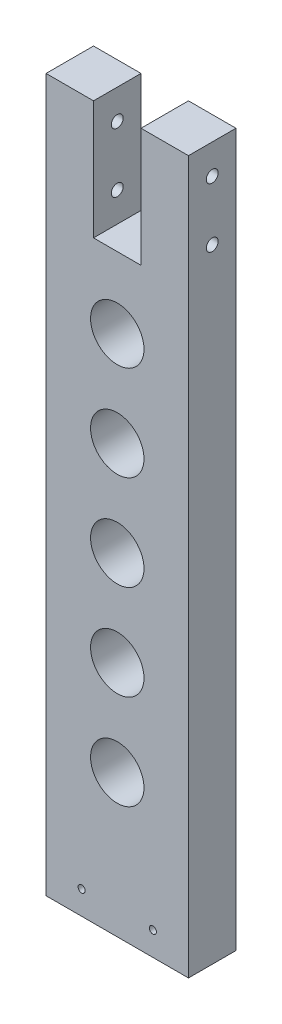
ISO-10303-21;
HEADER;
FILE_DESCRIPTION(('STEP AP214'),'2;1');
FILE_NAME('part.step','',(''),(''),'','','');
FILE_SCHEMA(('AUTOMOTIVE_DESIGN { 1 0 10303 214 1 1 1 1 }'));
ENDSEC;
DATA;
#1=APPLICATION_CONTEXT('core data for automotive mechanical design processes');
#2=APPLICATION_PROTOCOL_DEFINITION('international standard','automotive_design',2000,#1);
#3=PRODUCT_CONTEXT('',#1,'mechanical');
#4=PRODUCT('Part','Part','',(#3));
#5=PRODUCT_RELATED_PRODUCT_CATEGORY('part','',(#4));
#6=PRODUCT_DEFINITION_FORMATION('','',#4);
#7=PRODUCT_DEFINITION_CONTEXT('part definition',#1,'design');
#8=PRODUCT_DEFINITION('design','',#6,#7);
#9=PRODUCT_DEFINITION_SHAPE('','',#8);
#10=(LENGTH_UNIT() NAMED_UNIT(*) SI_UNIT(.MILLI.,.METRE.));
#11=(NAMED_UNIT(*) PLANE_ANGLE_UNIT() SI_UNIT($,.RADIAN.));
#12=(NAMED_UNIT(*) SI_UNIT($,.STERADIAN.) SOLID_ANGLE_UNIT());
#13=UNCERTAINTY_MEASURE_WITH_UNIT(LENGTH_MEASURE(1.E-05),#10,'distance_accuracy_value','');
#14=(GEOMETRIC_REPRESENTATION_CONTEXT(3) GLOBAL_UNCERTAINTY_ASSIGNED_CONTEXT((#13)) GLOBAL_UNIT_ASSIGNED_CONTEXT((#10,
#11,#12)) REPRESENTATION_CONTEXT('',''));
#15=CARTESIAN_POINT('',(0.,0.,0.));
#16=DIRECTION('',(0.,0.,1.));
#17=DIRECTION('',(1.,0.,0.));
#18=AXIS2_PLACEMENT_3D('',#15,#16,#17);
#19=CARTESIAN_POINT('',(0.,300.,0.));
#20=DIRECTION('',(0.,1.,0.));
#21=DIRECTION('',(0.,0.,1.));
#22=AXIS2_PLACEMENT_3D('',#19,#20,#21);
#23=PLANE('',#22);
#24=DIRECTION('',(0.,0.,1.));
#25=VECTOR('',#24,1.);
#26=CARTESIAN_POINT('',(-10.,300.,-10.));
#27=LINE('',#26,#25);
#28=CARTESIAN_POINT('',(-10.,300.,-10.));
#29=VERTEX_POINT('',#28);
#30=CARTESIAN_POINT('',(-10.,300.,10.));
#31=VERTEX_POINT('',#30);
#32=EDGE_CURVE('E141',#29,#31,#27,.T.);
#33=ORIENTED_EDGE('',*,*,#32,.F.);
#34=DIRECTION('',(-1.,0.,0.));
#35=VECTOR('',#34,1.);
#36=CARTESIAN_POINT('',(-30.,300.,-10.));
#37=LINE('',#36,#35);
#38=CARTESIAN_POINT('',(-30.,300.,-10.));
#39=VERTEX_POINT('',#38);
#40=EDGE_CURVE('E130',#29,#39,#37,.T.);
#41=ORIENTED_EDGE('',*,*,#40,.T.);
#42=DIRECTION('',(0.,0.,1.));
#43=VECTOR('',#42,1.);
#44=CARTESIAN_POINT('',(-30.,300.,-10.));
#45=LINE('',#44,#43);
#46=CARTESIAN_POINT('',(-30.,300.,10.));
#47=VERTEX_POINT('',#46);
#48=EDGE_CURVE('E150',#39,#47,#45,.T.);
#49=ORIENTED_EDGE('',*,*,#48,.T.);
#50=DIRECTION('',(1.,0.,0.));
#51=VECTOR('',#50,1.);
#52=CARTESIAN_POINT('',(-30.,300.,10.));
#53=LINE('',#52,#51);
#54=EDGE_CURVE('E152',#47,#31,#53,.T.);
#55=ORIENTED_EDGE('',*,*,#54,.T.);
#56=EDGE_LOOP('',(#33,#41,#49,#55));
#57=FACE_BOUND('',#56,.T.);
#58=ADVANCED_FACE('F32',(#57),#23,.T.);
#59=CARTESIAN_POINT('',(30.,300.,-10.));
#60=DIRECTION('',(-1.,0.,0.));
#61=DIRECTION('',(0.,0.,1.));
#62=AXIS2_PLACEMENT_3D('',#59,#60,#61);
#63=PLANE('',#62);
#64=CARTESIAN_POINT('',(30.,287.5,0.));
#65=DIRECTION('',(1.,0.,0.));
#66=DIRECTION('',(0.,0.,-1.));
#67=AXIS2_PLACEMENT_3D('',#64,#65,#66);
#68=CIRCLE('',#67,2.5);
#69=CARTESIAN_POINT('',(30.,287.5,-2.5));
#70=VERTEX_POINT('',#69);
#71=EDGE_CURVE('E283',#70,#70,#68,.T.);
#72=ORIENTED_EDGE('',*,*,#71,.F.);
#73=EDGE_LOOP('',(#72));
#74=FACE_BOUND('',#73,.T.);
#75=CARTESIAN_POINT('',(30.,262.5,0.));
#76=DIRECTION('',(1.,0.,0.));
#77=DIRECTION('',(0.,0.,-1.));
#78=AXIS2_PLACEMENT_3D('',#75,#76,#77);
#79=CIRCLE('',#78,2.5);
#80=CARTESIAN_POINT('',(30.,262.5,-2.5));
#81=VERTEX_POINT('',#80);
#82=EDGE_CURVE('E177',#81,#81,#79,.T.);
#83=ORIENTED_EDGE('',*,*,#82,.F.);
#84=EDGE_LOOP('',(#83));
#85=FACE_BOUND('',#84,.T.);
#86=DIRECTION('',(0.,0.,-1.));
#87=VECTOR('',#86,1.);
#88=CARTESIAN_POINT('',(30.,0.,-10.));
#89=LINE('',#88,#87);
#90=CARTESIAN_POINT('',(30.,0.,10.));
#91=VERTEX_POINT('',#90);
#92=CARTESIAN_POINT('',(30.,0.,-10.));
#93=VERTEX_POINT('',#92);
#94=EDGE_CURVE('E143',#91,#93,#89,.T.);
#95=ORIENTED_EDGE('',*,*,#94,.T.);
#96=DIRECTION('',(0.,-1.,0.));
#97=VECTOR('',#96,1.);
#98=CARTESIAN_POINT('',(30.,300.,-10.));
#99=LINE('',#98,#97);
#100=CARTESIAN_POINT('',(30.,300.,-10.));
#101=VERTEX_POINT('',#100);
#102=EDGE_CURVE('E11',#101,#93,#99,.T.);
#103=ORIENTED_EDGE('',*,*,#102,.F.);
#104=DIRECTION('',(0.,0.,-1.));
#105=VECTOR('',#104,1.);
#106=CARTESIAN_POINT('',(30.,300.,-10.));
#107=LINE('',#106,#105);
#108=CARTESIAN_POINT('',(30.,300.,10.));
#109=VERTEX_POINT('',#108);
#110=EDGE_CURVE('E147',#109,#101,#107,.T.);
#111=ORIENTED_EDGE('',*,*,#110,.F.);
#112=DIRECTION('',(0.,-1.,0.));
#113=VECTOR('',#112,1.);
#114=CARTESIAN_POINT('',(30.,300.,10.));
#115=LINE('',#114,#113);
#116=EDGE_CURVE('E155',#109,#91,#115,.T.);
#117=ORIENTED_EDGE('',*,*,#116,.T.);
#118=EDGE_LOOP('',(#95,#103,#111,#117));
#119=FACE_BOUND('',#118,.T.);
#120=ADVANCED_FACE('F34',(#74,#85,#119),#63,.F.);
#121=CARTESIAN_POINT('',(-30.,300.,-10.));
#122=DIRECTION('',(0.,0.,1.));
#123=DIRECTION('',(1.,0.,0.));
#124=AXIS2_PLACEMENT_3D('',#121,#122,#123);
#125=PLANE('',#124);
#126=CARTESIAN_POINT('',(15.,10.,-10.));
#127=DIRECTION('',(0.,0.,1.));
#128=DIRECTION('',(1.,0.,0.));
#129=AXIS2_PLACEMENT_3D('',#126,#127,#128);
#130=CIRCLE('',#129,1.5);
#131=CARTESIAN_POINT('',(16.5,10.,-10.));
#132=VERTEX_POINT('',#131);
#133=EDGE_CURVE('E186',#132,#132,#130,.T.);
#134=ORIENTED_EDGE('',*,*,#133,.T.);
#135=EDGE_LOOP('',(#134));
#136=FACE_BOUND('',#135,.T.);
#137=CARTESIAN_POINT('',(-15.,10.,-10.));
#138=DIRECTION('',(0.,0.,1.));
#139=DIRECTION('',(1.,0.,0.));
#140=AXIS2_PLACEMENT_3D('',#137,#138,#139);
#141=CIRCLE('',#140,1.5);
#142=CARTESIAN_POINT('',(-13.5,10.,-10.));
#143=VERTEX_POINT('',#142);
#144=EDGE_CURVE('E192',#143,#143,#141,.T.);
#145=ORIENTED_EDGE('',*,*,#144,.T.);
#146=EDGE_LOOP('',(#145));
#147=FACE_BOUND('',#146,.T.);
#148=CARTESIAN_POINT('',(0.,180.,-10.));
#149=DIRECTION('',(0.,0.,1.));
#150=DIRECTION('',(1.,0.,0.));
#151=AXIS2_PLACEMENT_3D('',#148,#149,#150);
#152=CIRCLE('',#151,11.25);
#153=CARTESIAN_POINT('',(11.25,180.,-10.));
#154=VERTEX_POINT('',#153);
#155=EDGE_CURVE('E218',#154,#154,#152,.T.);
#156=ORIENTED_EDGE('',*,*,#155,.T.);
#157=EDGE_LOOP('',(#156));
#158=FACE_BOUND('',#157,.T.);
#159=CARTESIAN_POINT('',(0.,140.,-10.));
#160=DIRECTION('',(0.,0.,1.));
#161=DIRECTION('',(1.,0.,0.));
#162=AXIS2_PLACEMENT_3D('',#159,#160,#161);
#163=CIRCLE('',#162,11.25);
#164=CARTESIAN_POINT('',(11.25,140.,-10.));
#165=VERTEX_POINT('',#164);
#166=EDGE_CURVE('E215',#165,#165,#163,.T.);
#167=ORIENTED_EDGE('',*,*,#166,.T.);
#168=EDGE_LOOP('',(#167));
#169=FACE_BOUND('',#168,.T.);
#170=CARTESIAN_POINT('',(0.,100.,-10.));
#171=DIRECTION('',(0.,0.,1.));
#172=DIRECTION('',(1.,0.,0.));
#173=AXIS2_PLACEMENT_3D('',#170,#171,#172);
#174=CIRCLE('',#173,11.25);
#175=CARTESIAN_POINT('',(11.25,100.,-10.));
#176=VERTEX_POINT('',#175);
#177=EDGE_CURVE('E212',#176,#176,#174,.T.);
#178=ORIENTED_EDGE('',*,*,#177,.T.);
#179=EDGE_LOOP('',(#178));
#180=FACE_BOUND('',#179,.T.);
#181=CARTESIAN_POINT('',(0.,60.,-10.));
#182=DIRECTION('',(0.,0.,1.));
#183=DIRECTION('',(1.,0.,0.));
#184=AXIS2_PLACEMENT_3D('',#181,#182,#183);
#185=CIRCLE('',#184,11.25);
#186=CARTESIAN_POINT('',(11.25,60.,-10.));
#187=VERTEX_POINT('',#186);
#188=EDGE_CURVE('E201',#187,#187,#185,.T.);
#189=ORIENTED_EDGE('',*,*,#188,.T.);
#190=EDGE_LOOP('',(#189));
#191=FACE_BOUND('',#190,.T.);
#192=CARTESIAN_POINT('',(0.,220.,-10.));
#193=DIRECTION('',(0.,0.,1.));
#194=DIRECTION('',(1.,0.,0.));
#195=AXIS2_PLACEMENT_3D('',#192,#193,#194);
#196=CIRCLE('',#195,11.25);
#197=CARTESIAN_POINT('',(11.25,220.,-10.));
#198=VERTEX_POINT('',#197);
#199=EDGE_CURVE('E135',#198,#198,#196,.T.);
#200=ORIENTED_EDGE('',*,*,#199,.T.);
#201=EDGE_LOOP('',(#200));
#202=FACE_BOUND('',#201,.T.);
#203=ORIENTED_EDGE('',*,*,#40,.F.);
#204=DIRECTION('',(0.,-1.,0.));
#205=VECTOR('',#204,1.);
#206=CARTESIAN_POINT('',(-10.,300.,-10.));
#207=LINE('',#206,#205);
#208=CARTESIAN_POINT('',(-10.,250.,-10.));
#209=VERTEX_POINT('',#208);
#210=EDGE_CURVE('E112',#29,#209,#207,.T.);
#211=ORIENTED_EDGE('',*,*,#210,.T.);
#212=DIRECTION('',(1.,0.,0.));
#213=VECTOR('',#212,1.);
#214=CARTESIAN_POINT('',(-10.,250.,-10.));
#215=LINE('',#214,#213);
#216=CARTESIAN_POINT('',(9.99999999999997,250.,-10.));
#217=VERTEX_POINT('',#216);
#218=EDGE_CURVE('E123',#209,#217,#215,.T.);
#219=ORIENTED_EDGE('',*,*,#218,.T.);
#220=DIRECTION('',(0.,1.,0.));
#221=VECTOR('',#220,1.);
#222=CARTESIAN_POINT('',(10.,300.,-10.));
#223=LINE('',#222,#221);
#224=CARTESIAN_POINT('',(10.,300.,-10.));
#225=VERTEX_POINT('',#224);
#226=EDGE_CURVE('E120',#217,#225,#223,.T.);
#227=ORIENTED_EDGE('',*,*,#226,.T.);
#228=EDGE_CURVE('E86',#101,#225,#37,.T.);
#229=ORIENTED_EDGE('',*,*,#228,.F.);
#230=ORIENTED_EDGE('',*,*,#102,.T.);
#231=DIRECTION('',(-1.,0.,0.));
#232=VECTOR('',#231,1.);
#233=CARTESIAN_POINT('',(-30.,0.,-10.));
#234=LINE('',#233,#232);
#235=CARTESIAN_POINT('',(-30.,0.,-10.));
#236=VERTEX_POINT('',#235);
#237=EDGE_CURVE('E158',#93,#236,#234,.T.);
#238=ORIENTED_EDGE('',*,*,#237,.T.);
#239=DIRECTION('',(0.,-1.,0.));
#240=VECTOR('',#239,1.);
#241=CARTESIAN_POINT('',(-30.,300.,-10.));
#242=LINE('',#241,#240);
#243=EDGE_CURVE('E41',#39,#236,#242,.T.);
#244=ORIENTED_EDGE('',*,*,#243,.F.);
#245=EDGE_LOOP('',(#203,#211,#219,#227,#229,#230,#238,#244));
#246=FACE_BOUND('',#245,.T.);
#247=ADVANCED_FACE('F128',(#136,#147,#158,#169,#180,#191,#202,#246),#125,.F.);
#248=CARTESIAN_POINT('',(-30.,300.,-10.));
#249=DIRECTION('',(1.,0.,0.));
#250=DIRECTION('',(0.,0.,-1.));
#251=AXIS2_PLACEMENT_3D('',#248,#249,#250);
#252=PLANE('',#251);
#253=CARTESIAN_POINT('',(-30.,287.5,0.));
#254=DIRECTION('',(1.,0.,0.));
#255=DIRECTION('',(0.,0.,-1.));
#256=AXIS2_PLACEMENT_3D('',#253,#254,#255);
#257=CIRCLE('',#256,2.5);
#258=CARTESIAN_POINT('',(-30.,287.5,-2.5));
#259=VERTEX_POINT('',#258);
#260=EDGE_CURVE('E281',#259,#259,#257,.T.);
#261=ORIENTED_EDGE('',*,*,#260,.T.);
#262=EDGE_LOOP('',(#261));
#263=FACE_BOUND('',#262,.T.);
#264=CARTESIAN_POINT('',(-30.,262.5,0.));
#265=DIRECTION('',(1.,0.,0.));
#266=DIRECTION('',(0.,0.,-1.));
#267=AXIS2_PLACEMENT_3D('',#264,#265,#266);
#268=CIRCLE('',#267,2.5);
#269=CARTESIAN_POINT('',(-30.,262.5,-2.5));
#270=VERTEX_POINT('',#269);
#271=EDGE_CURVE('E170',#270,#270,#268,.T.);
#272=ORIENTED_EDGE('',*,*,#271,.T.);
#273=EDGE_LOOP('',(#272));
#274=FACE_BOUND('',#273,.T.);
#275=DIRECTION('',(0.,0.,1.));
#276=VECTOR('',#275,1.);
#277=CARTESIAN_POINT('',(-30.,0.,-10.));
#278=LINE('',#277,#276);
#279=CARTESIAN_POINT('',(-30.,0.,10.));
#280=VERTEX_POINT('',#279);
#281=EDGE_CURVE('E160',#236,#280,#278,.T.);
#282=ORIENTED_EDGE('',*,*,#281,.T.);
#283=DIRECTION('',(0.,-1.,0.));
#284=VECTOR('',#283,1.);
#285=CARTESIAN_POINT('',(-30.,300.,10.));
#286=LINE('',#285,#284);
#287=EDGE_CURVE('E164',#47,#280,#286,.T.);
#288=ORIENTED_EDGE('',*,*,#287,.F.);
#289=ORIENTED_EDGE('',*,*,#48,.F.);
#290=ORIENTED_EDGE('',*,*,#243,.T.);
#291=EDGE_LOOP('',(#282,#288,#289,#290));
#292=FACE_BOUND('',#291,.T.);
#293=ADVANCED_FACE('F260',(#263,#274,#292),#252,.F.);
#294=CARTESIAN_POINT('',(-30.,300.,10.));
#295=DIRECTION('',(0.,0.,-1.));
#296=DIRECTION('',(-1.,0.,0.));
#297=AXIS2_PLACEMENT_3D('',#294,#295,#296);
#298=PLANE('',#297);
#299=CARTESIAN_POINT('',(15.,10.,10.));
#300=DIRECTION('',(0.,0.,1.));
#301=DIRECTION('',(1.,0.,0.));
#302=AXIS2_PLACEMENT_3D('',#299,#300,#301);
#303=CIRCLE('',#302,1.5);
#304=CARTESIAN_POINT('',(16.5,10.,10.));
#305=VERTEX_POINT('',#304);
#306=EDGE_CURVE('E174',#305,#305,#303,.T.);
#307=ORIENTED_EDGE('',*,*,#306,.F.);
#308=EDGE_LOOP('',(#307));
#309=FACE_BOUND('',#308,.T.);
#310=CARTESIAN_POINT('',(-15.,10.,10.));
#311=DIRECTION('',(0.,0.,1.));
#312=DIRECTION('',(1.,0.,0.));
#313=AXIS2_PLACEMENT_3D('',#310,#311,#312);
#314=CIRCLE('',#313,1.5);
#315=CARTESIAN_POINT('',(-13.5,10.,10.));
#316=VERTEX_POINT('',#315);
#317=EDGE_CURVE('E189',#316,#316,#314,.T.);
#318=ORIENTED_EDGE('',*,*,#317,.F.);
#319=EDGE_LOOP('',(#318));
#320=FACE_BOUND('',#319,.T.);
#321=CARTESIAN_POINT('',(0.,180.,10.));
#322=DIRECTION('',(0.,0.,1.));
#323=DIRECTION('',(1.,0.,0.));
#324=AXIS2_PLACEMENT_3D('',#321,#322,#323);
#325=CIRCLE('',#324,11.25);
#326=CARTESIAN_POINT('',(11.25,180.,10.));
#327=VERTEX_POINT('',#326);
#328=EDGE_CURVE('E198',#327,#327,#325,.T.);
#329=ORIENTED_EDGE('',*,*,#328,.F.);
#330=EDGE_LOOP('',(#329));
#331=FACE_BOUND('',#330,.T.);
#332=CARTESIAN_POINT('',(0.,140.,10.));
#333=DIRECTION('',(0.,0.,1.));
#334=DIRECTION('',(1.,0.,0.));
#335=AXIS2_PLACEMENT_3D('',#332,#333,#334);
#336=CIRCLE('',#335,11.25);
#337=CARTESIAN_POINT('',(11.25,140.,10.));
#338=VERTEX_POINT('',#337);
#339=EDGE_CURVE('E202',#338,#338,#336,.T.);
#340=ORIENTED_EDGE('',*,*,#339,.F.);
#341=EDGE_LOOP('',(#340));
#342=FACE_BOUND('',#341,.T.);
#343=CARTESIAN_POINT('',(0.,100.,10.));
#344=DIRECTION('',(0.,0.,1.));
#345=DIRECTION('',(1.,0.,0.));
#346=AXIS2_PLACEMENT_3D('',#343,#344,#345);
#347=CIRCLE('',#346,11.25);
#348=CARTESIAN_POINT('',(11.25,100.,10.));
#349=VERTEX_POINT('',#348);
#350=EDGE_CURVE('E205',#349,#349,#347,.T.);
#351=ORIENTED_EDGE('',*,*,#350,.F.);
#352=EDGE_LOOP('',(#351));
#353=FACE_BOUND('',#352,.T.);
#354=CARTESIAN_POINT('',(0.,60.,10.));
#355=DIRECTION('',(0.,0.,1.));
#356=DIRECTION('',(1.,0.,0.));
#357=AXIS2_PLACEMENT_3D('',#354,#355,#356);
#358=CIRCLE('',#357,11.25);
#359=CARTESIAN_POINT('',(11.25,60.,10.));
#360=VERTEX_POINT('',#359);
#361=EDGE_CURVE('E195',#360,#360,#358,.T.);
#362=ORIENTED_EDGE('',*,*,#361,.F.);
#363=EDGE_LOOP('',(#362));
#364=FACE_BOUND('',#363,.T.);
#365=CARTESIAN_POINT('',(0.,220.,10.));
#366=DIRECTION('',(0.,0.,1.));
#367=DIRECTION('',(1.,0.,0.));
#368=AXIS2_PLACEMENT_3D('',#365,#366,#367);
#369=CIRCLE('',#368,11.25);
#370=CARTESIAN_POINT('',(11.25,220.,10.));
#371=VERTEX_POINT('',#370);
#372=EDGE_CURVE('E220',#371,#371,#369,.T.);
#373=ORIENTED_EDGE('',*,*,#372,.F.);
#374=EDGE_LOOP('',(#373));
#375=FACE_BOUND('',#374,.T.);
#376=DIRECTION('',(1.,0.,0.));
#377=VECTOR('',#376,1.);
#378=CARTESIAN_POINT('',(-10.,250.,10.));
#379=LINE('',#378,#377);
#380=CARTESIAN_POINT('',(-10.,250.,10.));
#381=VERTEX_POINT('',#380);
#382=CARTESIAN_POINT('',(9.99999999999997,250.,10.));
#383=VERTEX_POINT('',#382);
#384=EDGE_CURVE('E132',#381,#383,#379,.T.);
#385=ORIENTED_EDGE('',*,*,#384,.F.);
#386=DIRECTION('',(0.,-1.,0.));
#387=VECTOR('',#386,1.);
#388=CARTESIAN_POINT('',(-10.,300.,10.));
#389=LINE('',#388,#387);
#390=EDGE_CURVE('E115',#31,#381,#389,.T.);
#391=ORIENTED_EDGE('',*,*,#390,.F.);
#392=ORIENTED_EDGE('',*,*,#54,.F.);
#393=ORIENTED_EDGE('',*,*,#287,.T.);
#394=DIRECTION('',(1.,0.,0.));
#395=VECTOR('',#394,1.);
#396=CARTESIAN_POINT('',(-30.,0.,10.));
#397=LINE('',#396,#395);
#398=EDGE_CURVE('E79',#280,#91,#397,.T.);
#399=ORIENTED_EDGE('',*,*,#398,.T.);
#400=ORIENTED_EDGE('',*,*,#116,.F.);
#401=CARTESIAN_POINT('',(10.,300.,10.));
#402=VERTEX_POINT('',#401);
#403=EDGE_CURVE('E57',#402,#109,#53,.T.);
#404=ORIENTED_EDGE('',*,*,#403,.F.);
#405=DIRECTION('',(0.,1.,0.));
#406=VECTOR('',#405,1.);
#407=CARTESIAN_POINT('',(10.,300.,10.));
#408=LINE('',#407,#406);
#409=EDGE_CURVE('E49',#383,#402,#408,.T.);
#410=ORIENTED_EDGE('',*,*,#409,.F.);
#411=EDGE_LOOP('',(#385,#391,#392,#393,#399,#400,#404,#410));
#412=FACE_BOUND('',#411,.T.);
#413=ADVANCED_FACE('F254',(#309,#320,#331,#342,#353,#364,#375,#412),#298,.F.);
#414=DIRECTION('',(0.,0.,1.));
#415=VECTOR('',#414,1.);
#416=CARTESIAN_POINT('',(10.,300.,-10.));
#417=LINE('',#416,#415);
#418=EDGE_CURVE('E144',#225,#402,#417,.T.);
#419=ORIENTED_EDGE('',*,*,#418,.T.);
#420=ORIENTED_EDGE('',*,*,#403,.T.);
#421=ORIENTED_EDGE('',*,*,#110,.T.);
#422=ORIENTED_EDGE('',*,*,#228,.T.);
#423=EDGE_LOOP('',(#419,#420,#421,#422));
#424=FACE_BOUND('',#423,.T.);
#425=ADVANCED_FACE('F245',(#424),#23,.T.);
#426=CARTESIAN_POINT('',(0.,0.,0.));
#427=DIRECTION('',(0.,1.,0.));
#428=DIRECTION('',(0.,0.,1.));
#429=AXIS2_PLACEMENT_3D('',#426,#427,#428);
#430=PLANE('',#429);
#431=ORIENTED_EDGE('',*,*,#94,.F.);
#432=ORIENTED_EDGE('',*,*,#398,.F.);
#433=ORIENTED_EDGE('',*,*,#281,.F.);
#434=ORIENTED_EDGE('',*,*,#237,.F.);
#435=EDGE_LOOP('',(#431,#432,#433,#434));
#436=FACE_BOUND('',#435,.T.);
#437=ADVANCED_FACE('F253',(#436),#430,.F.);
#438=CARTESIAN_POINT('',(-10.,300.,-10.));
#439=DIRECTION('',(-1.,0.,0.));
#440=DIRECTION('',(0.,0.,1.));
#441=AXIS2_PLACEMENT_3D('',#438,#439,#440);
#442=PLANE('',#441);
#443=CARTESIAN_POINT('',(-10.,287.5,0.));
#444=DIRECTION('',(-1.,0.,0.));
#445=DIRECTION('',(0.,0.,1.));
#446=AXIS2_PLACEMENT_3D('',#443,#444,#445);
#447=CIRCLE('',#446,2.5);
#448=CARTESIAN_POINT('',(-10.,287.5,2.5));
#449=VERTEX_POINT('',#448);
#450=EDGE_CURVE('E182',#449,#449,#447,.T.);
#451=ORIENTED_EDGE('',*,*,#450,.T.);
#452=EDGE_LOOP('',(#451));
#453=FACE_BOUND('',#452,.T.);
#454=CARTESIAN_POINT('',(-10.,262.5,0.));
#455=DIRECTION('',(-1.,0.,0.));
#456=DIRECTION('',(0.,0.,1.));
#457=AXIS2_PLACEMENT_3D('',#454,#455,#456);
#458=CIRCLE('',#457,2.5);
#459=CARTESIAN_POINT('',(-10.,262.5,2.5));
#460=VERTEX_POINT('',#459);
#461=EDGE_CURVE('E169',#460,#460,#458,.T.);
#462=ORIENTED_EDGE('',*,*,#461,.T.);
#463=EDGE_LOOP('',(#462));
#464=FACE_BOUND('',#463,.T.);
#465=ORIENTED_EDGE('',*,*,#390,.T.);
#466=DIRECTION('',(0.,0.,1.));
#467=VECTOR('',#466,1.);
#468=CARTESIAN_POINT('',(-10.,250.,-10.));
#469=LINE('',#468,#467);
#470=EDGE_CURVE('E108',#209,#381,#469,.T.);
#471=ORIENTED_EDGE('',*,*,#470,.F.);
#472=ORIENTED_EDGE('',*,*,#210,.F.);
#473=ORIENTED_EDGE('',*,*,#32,.T.);
#474=EDGE_LOOP('',(#465,#471,#472,#473));
#475=FACE_BOUND('',#474,.T.);
#476=ADVANCED_FACE('F110',(#453,#464,#475),#442,.F.);
#477=CARTESIAN_POINT('',(10.,300.,-10.));
#478=DIRECTION('',(1.,0.,0.));
#479=DIRECTION('',(0.,1.,0.));
#480=AXIS2_PLACEMENT_3D('',#477,#478,#479);
#481=PLANE('',#480);
#482=CARTESIAN_POINT('',(10.,287.5,0.));
#483=DIRECTION('',(1.,0.,0.));
#484=DIRECTION('',(0.,1.,0.));
#485=AXIS2_PLACEMENT_3D('',#482,#483,#484);
#486=CIRCLE('',#485,2.5);
#487=CARTESIAN_POINT('',(10.,290.,0.));
#488=VERTEX_POINT('',#487);
#489=EDGE_CURVE('E36',#488,#488,#486,.T.);
#490=ORIENTED_EDGE('',*,*,#489,.T.);
#491=EDGE_LOOP('',(#490));
#492=FACE_BOUND('',#491,.T.);
#493=CARTESIAN_POINT('',(9.99999999999998,262.5,0.));
#494=DIRECTION('',(1.,0.,0.));
#495=DIRECTION('',(0.,1.,0.));
#496=AXIS2_PLACEMENT_3D('',#493,#494,#495);
#497=CIRCLE('',#496,2.5);
#498=CARTESIAN_POINT('',(9.99999999999998,265.,0.));
#499=VERTEX_POINT('',#498);
#500=EDGE_CURVE('E167',#499,#499,#497,.T.);
#501=ORIENTED_EDGE('',*,*,#500,.T.);
#502=EDGE_LOOP('',(#501));
#503=FACE_BOUND('',#502,.T.);
#504=ORIENTED_EDGE('',*,*,#409,.T.);
#505=ORIENTED_EDGE('',*,*,#418,.F.);
#506=ORIENTED_EDGE('',*,*,#226,.F.);
#507=DIRECTION('',(0.,0.,1.));
#508=VECTOR('',#507,1.);
#509=CARTESIAN_POINT('',(9.99999999999997,250.,-10.));
#510=LINE('',#509,#508);
#511=EDGE_CURVE('E119',#217,#383,#510,.T.);
#512=ORIENTED_EDGE('',*,*,#511,.T.);
#513=EDGE_LOOP('',(#504,#505,#506,#512));
#514=FACE_BOUND('',#513,.T.);
#515=ADVANCED_FACE('F239',(#492,#503,#514),#481,.F.);
#516=CARTESIAN_POINT('',(-10.,250.,-10.));
#517=DIRECTION('',(0.,-1.,0.));
#518=DIRECTION('',(0.,0.,-1.));
#519=AXIS2_PLACEMENT_3D('',#516,#517,#518);
#520=PLANE('',#519);
#521=ORIENTED_EDGE('',*,*,#384,.T.);
#522=ORIENTED_EDGE('',*,*,#511,.F.);
#523=ORIENTED_EDGE('',*,*,#218,.F.);
#524=ORIENTED_EDGE('',*,*,#470,.T.);
#525=EDGE_LOOP('',(#521,#522,#523,#524));
#526=FACE_BOUND('',#525,.T.);
#527=ADVANCED_FACE('F124',(#526),#520,.F.);
#528=CARTESIAN_POINT('',(0.,220.,-290.));
#529=DIRECTION('',(0.,0.,1.));
#530=DIRECTION('',(1.,0.,0.));
#531=AXIS2_PLACEMENT_3D('',#528,#529,#530);
#532=CYLINDRICAL_SURFACE('',#531,11.25);
#533=ORIENTED_EDGE('',*,*,#372,.T.);
#534=EDGE_LOOP('',(#533));
#535=FACE_BOUND('',#534,.T.);
#536=ORIENTED_EDGE('',*,*,#199,.F.);
#537=EDGE_LOOP('',(#536));
#538=FACE_BOUND('',#537,.T.);
#539=ADVANCED_FACE('F228',(#535,#538),#532,.F.);
#540=CARTESIAN_POINT('',(0.,60.,-290.));
#541=DIRECTION('',(0.,0.,1.));
#542=DIRECTION('',(1.,0.,0.));
#543=AXIS2_PLACEMENT_3D('',#540,#541,#542);
#544=CYLINDRICAL_SURFACE('',#543,11.25);
#545=ORIENTED_EDGE('',*,*,#361,.T.);
#546=EDGE_LOOP('',(#545));
#547=FACE_BOUND('',#546,.T.);
#548=ORIENTED_EDGE('',*,*,#188,.F.);
#549=EDGE_LOOP('',(#548));
#550=FACE_BOUND('',#549,.T.);
#551=ADVANCED_FACE('F230',(#547,#550),#544,.F.);
#552=CARTESIAN_POINT('',(0.,100.,-290.));
#553=DIRECTION('',(0.,0.,1.));
#554=DIRECTION('',(1.,0.,0.));
#555=AXIS2_PLACEMENT_3D('',#552,#553,#554);
#556=CYLINDRICAL_SURFACE('',#555,11.25);
#557=ORIENTED_EDGE('',*,*,#350,.T.);
#558=EDGE_LOOP('',(#557));
#559=FACE_BOUND('',#558,.T.);
#560=ORIENTED_EDGE('',*,*,#177,.F.);
#561=EDGE_LOOP('',(#560));
#562=FACE_BOUND('',#561,.T.);
#563=ADVANCED_FACE('F236',(#559,#562),#556,.F.);
#564=CARTESIAN_POINT('',(0.,140.,-290.));
#565=DIRECTION('',(0.,0.,1.));
#566=DIRECTION('',(1.,0.,0.));
#567=AXIS2_PLACEMENT_3D('',#564,#565,#566);
#568=CYLINDRICAL_SURFACE('',#567,11.25);
#569=ORIENTED_EDGE('',*,*,#339,.T.);
#570=EDGE_LOOP('',(#569));
#571=FACE_BOUND('',#570,.T.);
#572=ORIENTED_EDGE('',*,*,#166,.F.);
#573=EDGE_LOOP('',(#572));
#574=FACE_BOUND('',#573,.T.);
#575=ADVANCED_FACE('F318',(#571,#574),#568,.F.);
#576=CARTESIAN_POINT('',(0.,180.,-290.));
#577=DIRECTION('',(0.,0.,1.));
#578=DIRECTION('',(1.,0.,0.));
#579=AXIS2_PLACEMENT_3D('',#576,#577,#578);
#580=CYLINDRICAL_SURFACE('',#579,11.25);
#581=ORIENTED_EDGE('',*,*,#328,.T.);
#582=EDGE_LOOP('',(#581));
#583=FACE_BOUND('',#582,.T.);
#584=ORIENTED_EDGE('',*,*,#155,.F.);
#585=EDGE_LOOP('',(#584));
#586=FACE_BOUND('',#585,.T.);
#587=ADVANCED_FACE('F314',(#583,#586),#580,.F.);
#588=CARTESIAN_POINT('',(-15.,10.,-10.));
#589=DIRECTION('',(0.,0.,1.));
#590=DIRECTION('',(1.,0.,0.));
#591=AXIS2_PLACEMENT_3D('',#588,#589,#590);
#592=CYLINDRICAL_SURFACE('',#591,1.5);
#593=CARTESIAN_POINT('',(-13.5,10.,-10.));
#594=CARTESIAN_POINT('',(-13.5,10.,-9.79166666666668));
#595=CARTESIAN_POINT('',(-13.5,10.,-9.58333333333334));
#596=CARTESIAN_POINT('',(-13.5,10.,-9.16666666666668));
#597=CARTESIAN_POINT('',(-13.5,10.,-8.95833333333334));
#598=CARTESIAN_POINT('',(-13.5,10.,-8.54166666666668));
#599=CARTESIAN_POINT('',(-13.5,10.,-8.33333333333334));
#600=CARTESIAN_POINT('',(-13.5,10.,-7.91666666666668));
#601=CARTESIAN_POINT('',(-13.5,10.,-7.70833333333334));
#602=CARTESIAN_POINT('',(-13.5,10.,-7.29166666666667));
#603=CARTESIAN_POINT('',(-13.5,10.,-7.08333333333334));
#604=CARTESIAN_POINT('',(-13.5,10.,-6.66666666666667));
#605=CARTESIAN_POINT('',(-13.5,10.,-6.45833333333334));
#606=CARTESIAN_POINT('',(-13.5,10.,-6.04166666666667));
#607=CARTESIAN_POINT('',(-13.5,10.,-5.83333333333334));
#608=CARTESIAN_POINT('',(-13.5,10.,-5.41666666666667));
#609=CARTESIAN_POINT('',(-13.5,10.,-5.20833333333334));
#610=CARTESIAN_POINT('',(-13.5,10.,-4.79166666666667));
#611=CARTESIAN_POINT('',(-13.5,10.,-4.58333333333334));
#612=CARTESIAN_POINT('',(-13.5,10.,-4.16666666666667));
#613=CARTESIAN_POINT('',(-13.5,10.,-3.95833333333334));
#614=CARTESIAN_POINT('',(-13.5,10.,-3.54166666666667));
#615=CARTESIAN_POINT('',(-13.5,10.,-3.33333333333334));
#616=CARTESIAN_POINT('',(-13.5,10.,-2.91666666666667));
#617=CARTESIAN_POINT('',(-13.5,10.,-2.70833333333334));
#618=CARTESIAN_POINT('',(-13.5,10.,-2.29166666666667));
#619=CARTESIAN_POINT('',(-13.5,10.,-2.08333333333334));
#620=CARTESIAN_POINT('',(-13.5,10.,-1.66666666666667));
#621=CARTESIAN_POINT('',(-13.5,10.,-1.45833333333334));
#622=CARTESIAN_POINT('',(-13.5,10.,-1.04166666666667));
#623=CARTESIAN_POINT('',(-13.5,10.,-0.833333333333341));
#624=CARTESIAN_POINT('',(-13.5,10.,-0.416666666666674));
#625=CARTESIAN_POINT('',(-13.5,10.,-0.20833333333334));
#626=CARTESIAN_POINT('',(-13.5,10.,0.208333333333327));
#627=CARTESIAN_POINT('',(-13.5,10.,0.41666666666666));
#628=CARTESIAN_POINT('',(-13.5,10.,0.833333333333327));
#629=CARTESIAN_POINT('',(-13.5,10.,1.04166666666666));
#630=CARTESIAN_POINT('',(-13.5,10.,1.45833333333333));
#631=CARTESIAN_POINT('',(-13.5,10.,1.66666666666666));
#632=CARTESIAN_POINT('',(-13.5,10.,2.08333333333333));
#633=CARTESIAN_POINT('',(-13.5,10.,2.29166666666666));
#634=CARTESIAN_POINT('',(-13.5,10.,2.70833333333333));
#635=CARTESIAN_POINT('',(-13.5,10.,2.91666666666666));
#636=CARTESIAN_POINT('',(-13.5,10.,3.33333333333333));
#637=CARTESIAN_POINT('',(-13.5,10.,3.54166666666666));
#638=CARTESIAN_POINT('',(-13.5,10.,3.95833333333333));
#639=CARTESIAN_POINT('',(-13.5,10.,4.16666666666666));
#640=CARTESIAN_POINT('',(-13.5,10.,4.58333333333333));
#641=CARTESIAN_POINT('',(-13.5,10.,4.79166666666666));
#642=CARTESIAN_POINT('',(-13.5,10.,5.20833333333333));
#643=CARTESIAN_POINT('',(-13.5,10.,5.41666666666666));
#644=CARTESIAN_POINT('',(-13.5,10.,5.83333333333333));
#645=CARTESIAN_POINT('',(-13.5,10.,6.04166666666666));
#646=CARTESIAN_POINT('',(-13.5,10.,6.45833333333333));
#647=CARTESIAN_POINT('',(-13.5,10.,6.66666666666666));
#648=CARTESIAN_POINT('',(-13.5,10.,7.08333333333333));
#649=CARTESIAN_POINT('',(-13.5,10.,7.29166666666666));
#650=CARTESIAN_POINT('',(-13.5,10.,7.70833333333333));
#651=CARTESIAN_POINT('',(-13.5,10.,7.91666666666666));
#652=CARTESIAN_POINT('',(-13.5,10.,8.33333333333333));
#653=CARTESIAN_POINT('',(-13.5,10.,8.54166666666666));
#654=CARTESIAN_POINT('',(-13.5,10.,8.95833333333333));
#655=CARTESIAN_POINT('',(-13.5,10.,9.16666666666666));
#656=CARTESIAN_POINT('',(-13.5,10.,9.58333333333333));
#657=CARTESIAN_POINT('',(-13.5,10.,9.79166666666667));
#658=CARTESIAN_POINT('',(-13.5,10.,10.));
#659=B_SPLINE_CURVE_WITH_KNOTS('',3,(#593,#594,#595,#596,#597,#598,#599,#600,#601,#602,#603,
#604,#605,#606,#607,#608,#609,#610,#611,#612,#613,#614,#615,#616,#617,#618,#619,#620,#621,#622,
#623,#624,#625,#626,#627,#628,#629,#630,#631,#632,#633,#634,#635,#636,#637,#638,#639,#640,#641,
#642,#643,#644,#645,#646,#647,#648,#649,#650,#651,#652,#653,#654,#655,#656,#657,#658),
.UNSPECIFIED.,.F.,.F.,(4,2,2,2,2,2,2,2,2,2,2,2,2,2,2,2,2,2,2,2,2,2,2,2,2,2,2,2,2,2,2,2,4),(0.,
0.625000000000001,1.25,1.875,2.5,3.125,3.75,4.375,5.,5.625,6.25,6.875,7.5,8.125,8.75,9.375,10.,
10.625,11.25,11.875,12.5,13.125,13.75,14.375,15.,15.625,16.25,16.875,17.5,18.125,18.75,19.375,
20.),.UNSPECIFIED.);
#660=EDGE_CURVE('BSEAM310',#143,#316,#659,.T.);
#661=ORIENTED_EDGE('',*,*,#144,.F.);
#662=ORIENTED_EDGE('',*,*,#317,.T.);
#663=ORIENTED_EDGE('',*,*,#660,.T.);
#664=ORIENTED_EDGE('',*,*,#660,.F.);
#665=EDGE_LOOP('',(#661,#663,#662,#664));
#666=FACE_BOUND('',#665,.T.);
#667=ADVANCED_FACE('F310',(#666),#592,.F.);
#668=CARTESIAN_POINT('',(15.,10.,-10.));
#669=DIRECTION('',(0.,0.,1.));
#670=DIRECTION('',(1.,0.,0.));
#671=AXIS2_PLACEMENT_3D('',#668,#669,#670);
#672=CYLINDRICAL_SURFACE('',#671,1.5);
#673=CARTESIAN_POINT('',(16.5,10.,-10.));
#674=CARTESIAN_POINT('',(16.5,10.,-9.79166666666668));
#675=CARTESIAN_POINT('',(16.5,10.,-9.58333333333334));
#676=CARTESIAN_POINT('',(16.5,10.,-9.16666666666668));
#677=CARTESIAN_POINT('',(16.5,10.,-8.95833333333334));
#678=CARTESIAN_POINT('',(16.5,10.,-8.54166666666668));
#679=CARTESIAN_POINT('',(16.5,10.,-8.33333333333334));
#680=CARTESIAN_POINT('',(16.5,10.,-7.91666666666668));
#681=CARTESIAN_POINT('',(16.5,10.,-7.70833333333334));
#682=CARTESIAN_POINT('',(16.5,10.,-7.29166666666667));
#683=CARTESIAN_POINT('',(16.5,10.,-7.08333333333334));
#684=CARTESIAN_POINT('',(16.5,10.,-6.66666666666667));
#685=CARTESIAN_POINT('',(16.5,10.,-6.45833333333334));
#686=CARTESIAN_POINT('',(16.5,10.,-6.04166666666667));
#687=CARTESIAN_POINT('',(16.5,10.,-5.83333333333334));
#688=CARTESIAN_POINT('',(16.5,10.,-5.41666666666667));
#689=CARTESIAN_POINT('',(16.5,10.,-5.20833333333334));
#690=CARTESIAN_POINT('',(16.5,10.,-4.79166666666667));
#691=CARTESIAN_POINT('',(16.5,10.,-4.58333333333334));
#692=CARTESIAN_POINT('',(16.5,10.,-4.16666666666667));
#693=CARTESIAN_POINT('',(16.5,10.,-3.95833333333334));
#694=CARTESIAN_POINT('',(16.5,10.,-3.54166666666667));
#695=CARTESIAN_POINT('',(16.5,10.,-3.33333333333334));
#696=CARTESIAN_POINT('',(16.5,10.,-2.91666666666667));
#697=CARTESIAN_POINT('',(16.5,10.,-2.70833333333334));
#698=CARTESIAN_POINT('',(16.5,10.,-2.29166666666667));
#699=CARTESIAN_POINT('',(16.5,10.,-2.08333333333334));
#700=CARTESIAN_POINT('',(16.5,10.,-1.66666666666667));
#701=CARTESIAN_POINT('',(16.5,10.,-1.45833333333334));
#702=CARTESIAN_POINT('',(16.5,10.,-1.04166666666667));
#703=CARTESIAN_POINT('',(16.5,10.,-0.833333333333341));
#704=CARTESIAN_POINT('',(16.5,10.,-0.416666666666674));
#705=CARTESIAN_POINT('',(16.5,10.,-0.20833333333334));
#706=CARTESIAN_POINT('',(16.5,10.,0.208333333333327));
#707=CARTESIAN_POINT('',(16.5,10.,0.41666666666666));
#708=CARTESIAN_POINT('',(16.5,10.,0.833333333333327));
#709=CARTESIAN_POINT('',(16.5,10.,1.04166666666666));
#710=CARTESIAN_POINT('',(16.5,10.,1.45833333333333));
#711=CARTESIAN_POINT('',(16.5,10.,1.66666666666666));
#712=CARTESIAN_POINT('',(16.5,10.,2.08333333333333));
#713=CARTESIAN_POINT('',(16.5,10.,2.29166666666666));
#714=CARTESIAN_POINT('',(16.5,10.,2.70833333333333));
#715=CARTESIAN_POINT('',(16.5,10.,2.91666666666666));
#716=CARTESIAN_POINT('',(16.5,10.,3.33333333333333));
#717=CARTESIAN_POINT('',(16.5,10.,3.54166666666666));
#718=CARTESIAN_POINT('',(16.5,10.,3.95833333333333));
#719=CARTESIAN_POINT('',(16.5,10.,4.16666666666666));
#720=CARTESIAN_POINT('',(16.5,10.,4.58333333333333));
#721=CARTESIAN_POINT('',(16.5,10.,4.79166666666666));
#722=CARTESIAN_POINT('',(16.5,10.,5.20833333333333));
#723=CARTESIAN_POINT('',(16.5,10.,5.41666666666666));
#724=CARTESIAN_POINT('',(16.5,10.,5.83333333333333));
#725=CARTESIAN_POINT('',(16.5,10.,6.04166666666666));
#726=CARTESIAN_POINT('',(16.5,10.,6.45833333333333));
#727=CARTESIAN_POINT('',(16.5,10.,6.66666666666666));
#728=CARTESIAN_POINT('',(16.5,10.,7.08333333333333));
#729=CARTESIAN_POINT('',(16.5,10.,7.29166666666666));
#730=CARTESIAN_POINT('',(16.5,10.,7.70833333333333));
#731=CARTESIAN_POINT('',(16.5,10.,7.91666666666666));
#732=CARTESIAN_POINT('',(16.5,10.,8.33333333333333));
#733=CARTESIAN_POINT('',(16.5,10.,8.54166666666666));
#734=CARTESIAN_POINT('',(16.5,10.,8.95833333333333));
#735=CARTESIAN_POINT('',(16.5,10.,9.16666666666666));
#736=CARTESIAN_POINT('',(16.5,10.,9.58333333333333));
#737=CARTESIAN_POINT('',(16.5,10.,9.79166666666667));
#738=CARTESIAN_POINT('',(16.5,10.,10.));
#739=B_SPLINE_CURVE_WITH_KNOTS('',3,(#673,#674,#675,#676,#677,#678,#679,#680,#681,#682,#683,
#684,#685,#686,#687,#688,#689,#690,#691,#692,#693,#694,#695,#696,#697,#698,#699,#700,#701,#702,
#703,#704,#705,#706,#707,#708,#709,#710,#711,#712,#713,#714,#715,#716,#717,#718,#719,#720,#721,
#722,#723,#724,#725,#726,#727,#728,#729,#730,#731,#732,#733,#734,#735,#736,#737,#738),
.UNSPECIFIED.,.F.,.F.,(4,2,2,2,2,2,2,2,2,2,2,2,2,2,2,2,2,2,2,2,2,2,2,2,2,2,2,2,2,2,2,2,4),(0.,
0.625000000000001,1.25,1.875,2.5,3.125,3.75,4.375,5.,5.625,6.25,6.875,7.5,8.125,8.75,9.375,10.,
10.625,11.25,11.875,12.5,13.125,13.75,14.375,15.,15.625,16.25,16.875,17.5,18.125,18.75,19.375,
20.),.UNSPECIFIED.);
#740=EDGE_CURVE('BSEAM307',#132,#305,#739,.T.);
#741=ORIENTED_EDGE('',*,*,#133,.F.);
#742=ORIENTED_EDGE('',*,*,#306,.T.);
#743=ORIENTED_EDGE('',*,*,#740,.T.);
#744=ORIENTED_EDGE('',*,*,#740,.F.);
#745=EDGE_LOOP('',(#741,#743,#742,#744));
#746=FACE_BOUND('',#745,.T.);
#747=ADVANCED_FACE('F307',(#746),#672,.F.);
#748=CARTESIAN_POINT('',(-30.,262.5,0.));
#749=DIRECTION('',(1.,0.,0.));
#750=DIRECTION('',(0.,0.,-1.));
#751=AXIS2_PLACEMENT_3D('',#748,#749,#750);
#752=CYLINDRICAL_SURFACE('',#751,2.5);
#753=ORIENTED_EDGE('',*,*,#82,.T.);
#754=EDGE_LOOP('',(#753));
#755=FACE_BOUND('',#754,.T.);
#756=ORIENTED_EDGE('',*,*,#500,.F.);
#757=EDGE_LOOP('',(#756));
#758=FACE_BOUND('',#757,.T.);
#759=ADVANCED_FACE('F305',(#755,#758),#752,.F.);
#760=ORIENTED_EDGE('',*,*,#271,.F.);
#761=EDGE_LOOP('',(#760));
#762=FACE_BOUND('',#761,.T.);
#763=ORIENTED_EDGE('',*,*,#461,.F.);
#764=EDGE_LOOP('',(#763));
#765=FACE_BOUND('',#764,.T.);
#766=ADVANCED_FACE('F300',(#762,#765),#752,.F.);
#767=CARTESIAN_POINT('',(-30.,287.5,0.));
#768=DIRECTION('',(1.,0.,0.));
#769=DIRECTION('',(0.,0.,-1.));
#770=AXIS2_PLACEMENT_3D('',#767,#768,#769);
#771=CYLINDRICAL_SURFACE('',#770,2.5);
#772=ORIENTED_EDGE('',*,*,#71,.T.);
#773=EDGE_LOOP('',(#772));
#774=FACE_BOUND('',#773,.T.);
#775=ORIENTED_EDGE('',*,*,#489,.F.);
#776=EDGE_LOOP('',(#775));
#777=FACE_BOUND('',#776,.T.);
#778=ADVANCED_FACE('F295',(#774,#777),#771,.F.);
#779=ORIENTED_EDGE('',*,*,#260,.F.);
#780=EDGE_LOOP('',(#779));
#781=FACE_BOUND('',#780,.T.);
#782=ORIENTED_EDGE('',*,*,#450,.F.);
#783=EDGE_LOOP('',(#782));
#784=FACE_BOUND('',#783,.T.);
#785=ADVANCED_FACE('F293',(#781,#784),#771,.F.);
#786=CLOSED_SHELL('',(#58,#120,#247,#293,#413,#425,#437,#476,#515,#527,#539,#551,#563,#575,#587,
#667,#747,#759,#766,#778,#785));
#787=MANIFOLD_SOLID_BREP('B2',#786);
#788=ADVANCED_BREP_SHAPE_REPRESENTATION('',(#18,#787),#14);
#789=SHAPE_DEFINITION_REPRESENTATION(#9,#788);
ENDSEC;
END-ISO-10303-21;
